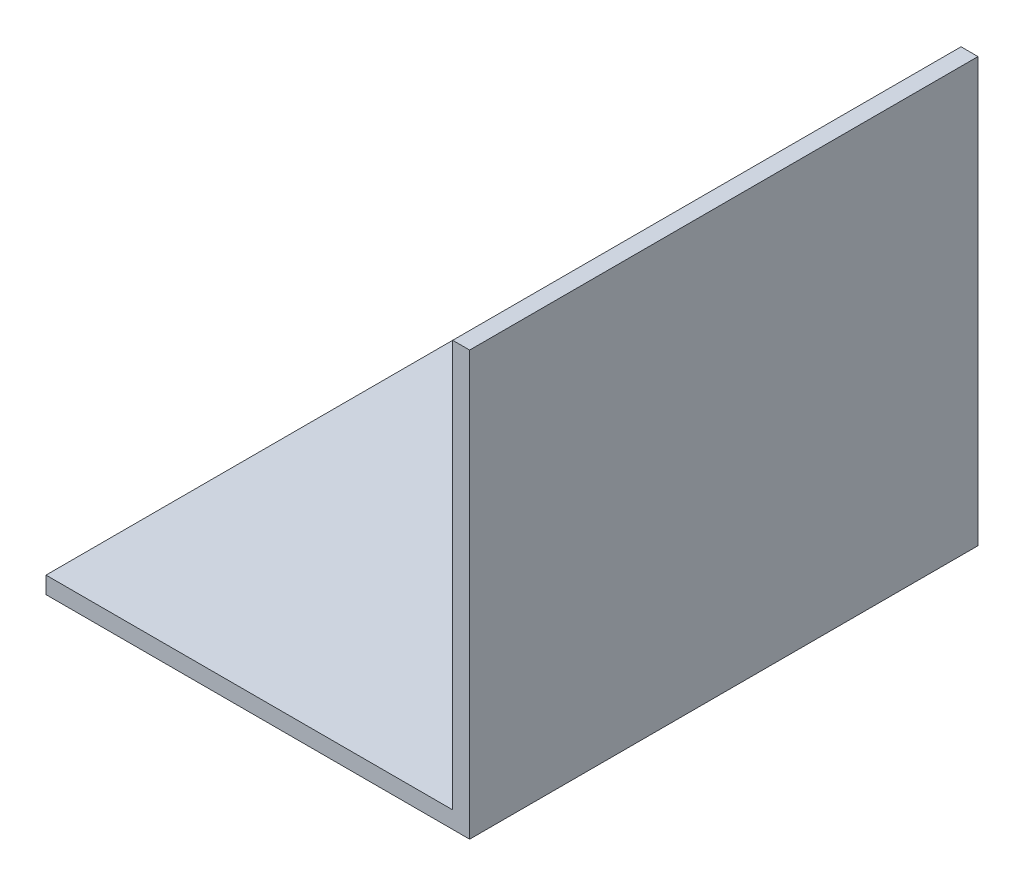
ISO-10303-21;
HEADER;
FILE_DESCRIPTION(('STEP AP214'),'2;1');
FILE_NAME('part.step','',(''),(''),'','','');
FILE_SCHEMA(('AUTOMOTIVE_DESIGN { 1 0 10303 214 1 1 1 1 }'));
ENDSEC;
DATA;
#1=APPLICATION_CONTEXT('core data for automotive mechanical design processes');
#2=APPLICATION_PROTOCOL_DEFINITION('international standard','automotive_design',2000,#1);
#3=PRODUCT_CONTEXT('',#1,'mechanical');
#4=PRODUCT('Part','Part','',(#3));
#5=PRODUCT_RELATED_PRODUCT_CATEGORY('part','',(#4));
#6=PRODUCT_DEFINITION_FORMATION('','',#4);
#7=PRODUCT_DEFINITION_CONTEXT('part definition',#1,'design');
#8=PRODUCT_DEFINITION('design','',#6,#7);
#9=PRODUCT_DEFINITION_SHAPE('','',#8);
#10=(LENGTH_UNIT() NAMED_UNIT(*) SI_UNIT(.MILLI.,.METRE.));
#11=(NAMED_UNIT(*) PLANE_ANGLE_UNIT() SI_UNIT($,.RADIAN.));
#12=(NAMED_UNIT(*) SI_UNIT($,.STERADIAN.) SOLID_ANGLE_UNIT());
#13=UNCERTAINTY_MEASURE_WITH_UNIT(LENGTH_MEASURE(1.E-05),#10,'distance_accuracy_value','');
#14=(GEOMETRIC_REPRESENTATION_CONTEXT(3) GLOBAL_UNCERTAINTY_ASSIGNED_CONTEXT((#13)) GLOBAL_UNIT_ASSIGNED_CONTEXT((#10,
#11,#12)) REPRESENTATION_CONTEXT('',''));
#15=CARTESIAN_POINT('',(0.,0.,0.));
#16=DIRECTION('',(0.,0.,1.));
#17=DIRECTION('',(1.,0.,0.));
#18=AXIS2_PLACEMENT_3D('',#15,#16,#17);
#19=CARTESIAN_POINT('',(-31.1601317484179,-11.5640370150317,60.));
#20=DIRECTION('',(1.,0.,0.));
#21=DIRECTION('',(0.,0.,-1.));
#22=AXIS2_PLACEMENT_3D('',#19,#20,#21);
#23=PLANE('',#22);
#24=DIRECTION('',(0.,-1.,0.));
#25=VECTOR('',#24,1.);
#26=CARTESIAN_POINT('',(-31.1601317484179,-11.5640370150317,0.));
#27=LINE('',#26,#25);
#28=CARTESIAN_POINT('',(-31.1601317484179,-11.5640370150317,0.));
#29=VERTEX_POINT('',#28);
#30=CARTESIAN_POINT('',(-31.1601317484179,-13.5640370150317,0.));
#31=VERTEX_POINT('',#30);
#32=EDGE_CURVE('E117',#29,#31,#27,.T.);
#33=ORIENTED_EDGE('',*,*,#32,.T.);
#34=DIRECTION('',(0.,0.,-1.));
#35=VECTOR('',#34,1.);
#36=CARTESIAN_POINT('',(-31.1601317484179,-13.5640370150317,60.));
#37=LINE('',#36,#35);
#38=CARTESIAN_POINT('',(-31.1601317484179,-13.5640370150317,60.));
#39=VERTEX_POINT('',#38);
#40=EDGE_CURVE('E11',#39,#31,#37,.T.);
#41=ORIENTED_EDGE('',*,*,#40,.F.);
#42=DIRECTION('',(0.,-1.,0.));
#43=VECTOR('',#42,1.);
#44=CARTESIAN_POINT('',(-31.1601317484179,-11.5640370150317,60.));
#45=LINE('',#44,#43);
#46=CARTESIAN_POINT('',(-31.1601317484179,-11.5640370150317,60.));
#47=VERTEX_POINT('',#46);
#48=EDGE_CURVE('E127',#47,#39,#45,.T.);
#49=ORIENTED_EDGE('',*,*,#48,.F.);
#50=DIRECTION('',(0.,0.,-1.));
#51=VECTOR('',#50,1.);
#52=CARTESIAN_POINT('',(-31.1601317484179,-11.5640370150317,60.));
#53=LINE('',#52,#51);
#54=EDGE_CURVE('E113',#47,#29,#53,.T.);
#55=ORIENTED_EDGE('',*,*,#54,.T.);
#56=EDGE_LOOP('',(#33,#41,#49,#55));
#57=FACE_BOUND('',#56,.T.);
#58=ADVANCED_FACE('F33',(#57),#23,.F.);
#59=CARTESIAN_POINT('',(-31.1601317484179,-13.5640370150317,60.));
#60=DIRECTION('',(0.,1.,0.));
#61=DIRECTION('',(0.,0.,1.));
#62=AXIS2_PLACEMENT_3D('',#59,#60,#61);
#63=PLANE('',#62);
#64=DIRECTION('',(1.,0.,0.));
#65=VECTOR('',#64,1.);
#66=CARTESIAN_POINT('',(-31.1601317484179,-13.5640370150317,0.));
#67=LINE('',#66,#65);
#68=CARTESIAN_POINT('',(18.8398682515821,-13.5640370150317,0.));
#69=VERTEX_POINT('',#68);
#70=EDGE_CURVE('E120',#31,#69,#67,.T.);
#71=ORIENTED_EDGE('',*,*,#70,.T.);
#72=DIRECTION('',(0.,0.,-1.));
#73=VECTOR('',#72,1.);
#74=CARTESIAN_POINT('',(18.8398682515821,-13.5640370150317,60.));
#75=LINE('',#74,#73);
#76=CARTESIAN_POINT('',(18.8398682515821,-13.5640370150317,60.));
#77=VERTEX_POINT('',#76);
#78=EDGE_CURVE('E41',#77,#69,#75,.T.);
#79=ORIENTED_EDGE('',*,*,#78,.F.);
#80=DIRECTION('',(1.,0.,0.));
#81=VECTOR('',#80,1.);
#82=CARTESIAN_POINT('',(-31.1601317484179,-13.5640370150317,60.));
#83=LINE('',#82,#81);
#84=EDGE_CURVE('E86',#39,#77,#83,.T.);
#85=ORIENTED_EDGE('',*,*,#84,.F.);
#86=ORIENTED_EDGE('',*,*,#40,.T.);
#87=EDGE_LOOP('',(#71,#79,#85,#86));
#88=FACE_BOUND('',#87,.T.);
#89=ADVANCED_FACE('F151',(#88),#63,.F.);
#90=CARTESIAN_POINT('',(18.8398682515821,-13.5640370150317,60.));
#91=DIRECTION('',(-1.,0.,0.));
#92=DIRECTION('',(0.,0.,1.));
#93=AXIS2_PLACEMENT_3D('',#90,#91,#92);
#94=PLANE('',#93);
#95=DIRECTION('',(0.,1.,0.));
#96=VECTOR('',#95,1.);
#97=CARTESIAN_POINT('',(18.8398682515821,-13.5640370150317,0.));
#98=LINE('',#97,#96);
#99=CARTESIAN_POINT('',(18.8398682515821,36.4359629849683,0.));
#100=VERTEX_POINT('',#99);
#101=EDGE_CURVE('E122',#69,#100,#98,.T.);
#102=ORIENTED_EDGE('',*,*,#101,.T.);
#103=DIRECTION('',(0.,0.,-1.));
#104=VECTOR('',#103,1.);
#105=CARTESIAN_POINT('',(18.8398682515821,36.4359629849683,60.));
#106=LINE('',#105,#104);
#107=CARTESIAN_POINT('',(18.8398682515821,36.4359629849683,60.));
#108=VERTEX_POINT('',#107);
#109=EDGE_CURVE('E108',#108,#100,#106,.T.);
#110=ORIENTED_EDGE('',*,*,#109,.F.);
#111=DIRECTION('',(0.,1.,0.));
#112=VECTOR('',#111,1.);
#113=CARTESIAN_POINT('',(18.8398682515821,-13.5640370150317,60.));
#114=LINE('',#113,#112);
#115=EDGE_CURVE('E99',#77,#108,#114,.T.);
#116=ORIENTED_EDGE('',*,*,#115,.F.);
#117=ORIENTED_EDGE('',*,*,#78,.T.);
#118=EDGE_LOOP('',(#102,#110,#116,#117));
#119=FACE_BOUND('',#118,.T.);
#120=ADVANCED_FACE('F133',(#119),#94,.F.);
#121=CARTESIAN_POINT('',(18.8398682515821,36.4359629849683,60.));
#122=DIRECTION('',(0.,-1.,0.));
#123=DIRECTION('',(1.,0.,0.));
#124=AXIS2_PLACEMENT_3D('',#121,#122,#123);
#125=PLANE('',#124);
#126=DIRECTION('',(-1.,0.,0.));
#127=VECTOR('',#126,1.);
#128=CARTESIAN_POINT('',(18.8398682515821,36.4359629849683,0.));
#129=LINE('',#128,#127);
#130=CARTESIAN_POINT('',(16.8398682515821,36.4359629849683,0.));
#131=VERTEX_POINT('',#130);
#132=EDGE_CURVE('E107',#100,#131,#129,.T.);
#133=ORIENTED_EDGE('',*,*,#132,.T.);
#134=DIRECTION('',(0.,0.,-1.));
#135=VECTOR('',#134,1.);
#136=CARTESIAN_POINT('',(16.8398682515821,36.4359629849683,60.));
#137=LINE('',#136,#135);
#138=CARTESIAN_POINT('',(16.8398682515821,36.4359629849683,60.));
#139=VERTEX_POINT('',#138);
#140=EDGE_CURVE('E104',#139,#131,#137,.T.);
#141=ORIENTED_EDGE('',*,*,#140,.F.);
#142=DIRECTION('',(-1.,0.,0.));
#143=VECTOR('',#142,1.);
#144=CARTESIAN_POINT('',(18.8398682515821,36.4359629849683,60.));
#145=LINE('',#144,#143);
#146=EDGE_CURVE('E93',#108,#139,#145,.T.);
#147=ORIENTED_EDGE('',*,*,#146,.F.);
#148=ORIENTED_EDGE('',*,*,#109,.T.);
#149=EDGE_LOOP('',(#133,#141,#147,#148));
#150=FACE_BOUND('',#149,.T.);
#151=ADVANCED_FACE('F105',(#150),#125,.F.);
#152=CARTESIAN_POINT('',(16.8398682515821,36.4359629849683,60.));
#153=DIRECTION('',(1.,0.,0.));
#154=DIRECTION('',(0.,1.,0.));
#155=AXIS2_PLACEMENT_3D('',#152,#153,#154);
#156=PLANE('',#155);
#157=DIRECTION('',(0.,-1.,0.));
#158=VECTOR('',#157,1.);
#159=CARTESIAN_POINT('',(16.8398682515821,36.4359629849683,0.));
#160=LINE('',#159,#158);
#161=CARTESIAN_POINT('',(16.8398682515821,-11.5640370150317,0.));
#162=VERTEX_POINT('',#161);
#163=EDGE_CURVE('E72',#131,#162,#160,.T.);
#164=ORIENTED_EDGE('',*,*,#163,.T.);
#165=DIRECTION('',(0.,0.,-1.));
#166=VECTOR('',#165,1.);
#167=CARTESIAN_POINT('',(16.8398682515821,-11.5640370150317,60.));
#168=LINE('',#167,#166);
#169=CARTESIAN_POINT('',(16.8398682515821,-11.5640370150317,60.));
#170=VERTEX_POINT('',#169);
#171=EDGE_CURVE('E109',#170,#162,#168,.T.);
#172=ORIENTED_EDGE('',*,*,#171,.F.);
#173=DIRECTION('',(0.,-1.,0.));
#174=VECTOR('',#173,1.);
#175=CARTESIAN_POINT('',(16.8398682515821,36.4359629849683,60.));
#176=LINE('',#175,#174);
#177=EDGE_CURVE('E97',#139,#170,#176,.T.);
#178=ORIENTED_EDGE('',*,*,#177,.F.);
#179=ORIENTED_EDGE('',*,*,#140,.T.);
#180=EDGE_LOOP('',(#164,#172,#178,#179));
#181=FACE_BOUND('',#180,.T.);
#182=ADVANCED_FACE('F111',(#181),#156,.F.);
#183=CARTESIAN_POINT('',(16.8398682515821,-11.5640370150317,60.));
#184=DIRECTION('',(0.,-1.,0.));
#185=DIRECTION('',(1.,0.,0.));
#186=AXIS2_PLACEMENT_3D('',#183,#184,#185);
#187=PLANE('',#186);
#188=DIRECTION('',(-1.,0.,0.));
#189=VECTOR('',#188,1.);
#190=CARTESIAN_POINT('',(16.8398682515821,-11.5640370150317,0.));
#191=LINE('',#190,#189);
#192=EDGE_CURVE('E78',#162,#29,#191,.T.);
#193=ORIENTED_EDGE('',*,*,#192,.T.);
#194=ORIENTED_EDGE('',*,*,#54,.F.);
#195=DIRECTION('',(-1.,0.,0.));
#196=VECTOR('',#195,1.);
#197=CARTESIAN_POINT('',(16.8398682515821,-11.5640370150317,60.));
#198=LINE('',#197,#196);
#199=EDGE_CURVE('E49',#170,#47,#198,.T.);
#200=ORIENTED_EDGE('',*,*,#199,.F.);
#201=ORIENTED_EDGE('',*,*,#171,.T.);
#202=EDGE_LOOP('',(#193,#194,#200,#201));
#203=FACE_BOUND('',#202,.T.);
#204=ADVANCED_FACE('F140',(#203),#187,.F.);
#205=CARTESIAN_POINT('',(0.,0.,60.));
#206=DIRECTION('',(0.,0.,1.));
#207=DIRECTION('',(1.,0.,0.));
#208=AXIS2_PLACEMENT_3D('',#205,#206,#207);
#209=PLANE('',#208);
#210=ORIENTED_EDGE('',*,*,#48,.T.);
#211=ORIENTED_EDGE('',*,*,#84,.T.);
#212=ORIENTED_EDGE('',*,*,#115,.T.);
#213=ORIENTED_EDGE('',*,*,#146,.T.);
#214=ORIENTED_EDGE('',*,*,#177,.T.);
#215=ORIENTED_EDGE('',*,*,#199,.T.);
#216=EDGE_LOOP('',(#210,#211,#212,#213,#214,#215));
#217=FACE_BOUND('',#216,.T.);
#218=ADVANCED_FACE('F95',(#217),#209,.T.);
#219=CARTESIAN_POINT('',(0.,0.,0.));
#220=DIRECTION('',(0.,0.,1.));
#221=DIRECTION('',(1.,0.,0.));
#222=AXIS2_PLACEMENT_3D('',#219,#220,#221);
#223=PLANE('',#222);
#224=ORIENTED_EDGE('',*,*,#32,.F.);
#225=ORIENTED_EDGE('',*,*,#192,.F.);
#226=ORIENTED_EDGE('',*,*,#163,.F.);
#227=ORIENTED_EDGE('',*,*,#132,.F.);
#228=ORIENTED_EDGE('',*,*,#101,.F.);
#229=ORIENTED_EDGE('',*,*,#70,.F.);
#230=EDGE_LOOP('',(#224,#225,#226,#227,#228,#229));
#231=FACE_BOUND('',#230,.T.);
#232=ADVANCED_FACE('F136',(#231),#223,.F.);
#233=CLOSED_SHELL('',(#58,#89,#120,#151,#182,#204,#218,#232));
#234=MANIFOLD_SOLID_BREP('B2',#233);
#235=ADVANCED_BREP_SHAPE_REPRESENTATION('',(#18,#234),#14);
#236=SHAPE_DEFINITION_REPRESENTATION(#9,#235);
ENDSEC;
END-ISO-10303-21;
